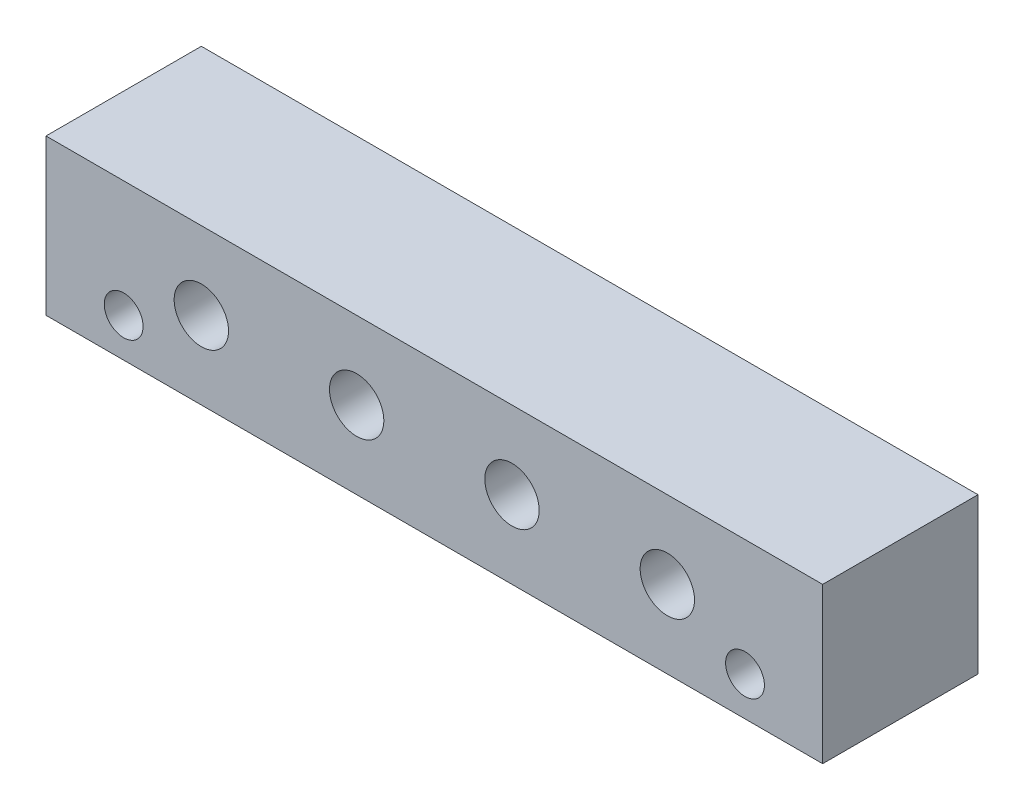
ISO-10303-21;
HEADER;
FILE_DESCRIPTION(('STEP AP214'),'2;1');
FILE_NAME('part.step','',(''),(''),'','','');
FILE_SCHEMA(('AUTOMOTIVE_DESIGN { 1 0 10303 214 1 1 1 1 }'));
ENDSEC;
DATA;
#1=APPLICATION_CONTEXT('core data for automotive mechanical design processes');
#2=APPLICATION_PROTOCOL_DEFINITION('international standard','automotive_design',2000,#1);
#3=PRODUCT_CONTEXT('',#1,'mechanical');
#4=PRODUCT('Part','Part','',(#3));
#5=PRODUCT_RELATED_PRODUCT_CATEGORY('part','',(#4));
#6=PRODUCT_DEFINITION_FORMATION('','',#4);
#7=PRODUCT_DEFINITION_CONTEXT('part definition',#1,'design');
#8=PRODUCT_DEFINITION('design','',#6,#7);
#9=PRODUCT_DEFINITION_SHAPE('','',#8);
#10=(LENGTH_UNIT() NAMED_UNIT(*) SI_UNIT(.MILLI.,.METRE.));
#11=(NAMED_UNIT(*) PLANE_ANGLE_UNIT() SI_UNIT($,.RADIAN.));
#12=(NAMED_UNIT(*) SI_UNIT($,.STERADIAN.) SOLID_ANGLE_UNIT());
#13=UNCERTAINTY_MEASURE_WITH_UNIT(LENGTH_MEASURE(1.E-05),#10,'distance_accuracy_value','');
#14=(GEOMETRIC_REPRESENTATION_CONTEXT(3) GLOBAL_UNCERTAINTY_ASSIGNED_CONTEXT((#13)) GLOBAL_UNIT_ASSIGNED_CONTEXT((#10,
#11,#12)) REPRESENTATION_CONTEXT('',''));
#15=CARTESIAN_POINT('',(0.,0.,0.));
#16=DIRECTION('',(0.,0.,1.));
#17=DIRECTION('',(1.,0.,0.));
#18=AXIS2_PLACEMENT_3D('',#15,#16,#17);
#19=CARTESIAN_POINT('',(0.,0.,10.));
#20=DIRECTION('',(0.,0.,-1.));
#21=DIRECTION('',(-1.,0.,0.));
#22=AXIS2_PLACEMENT_3D('',#19,#20,#21);
#23=PLANE('',#22);
#24=DIRECTION('',(0.,-1.,0.));
#25=VECTOR('',#24,1.);
#26=CARTESIAN_POINT('',(0.,0.,10.));
#27=LINE('',#26,#25);
#28=CARTESIAN_POINT('',(0.,10.,10.));
#29=VERTEX_POINT('',#28);
#30=CARTESIAN_POINT('',(0.,0.,10.));
#31=VERTEX_POINT('',#30);
#32=EDGE_CURVE('E85',#29,#31,#27,.T.);
#33=ORIENTED_EDGE('',*,*,#32,.T.);
#34=DIRECTION('',(1.,0.,0.));
#35=VECTOR('',#34,1.);
#36=CARTESIAN_POINT('',(0.,0.,10.));
#37=LINE('',#36,#35);
#38=CARTESIAN_POINT('',(50.,0.,10.));
#39=VERTEX_POINT('',#38);
#40=EDGE_CURVE('E80',#31,#39,#37,.T.);
#41=ORIENTED_EDGE('',*,*,#40,.T.);
#42=DIRECTION('',(0.,1.,0.));
#43=VECTOR('',#42,1.);
#44=CARTESIAN_POINT('',(50.,0.,10.));
#45=LINE('',#44,#43);
#46=CARTESIAN_POINT('',(50.,10.,10.));
#47=VERTEX_POINT('',#46);
#48=EDGE_CURVE('E83',#39,#47,#45,.T.);
#49=ORIENTED_EDGE('',*,*,#48,.T.);
#50=DIRECTION('',(-1.,0.,0.));
#51=VECTOR('',#50,1.);
#52=CARTESIAN_POINT('',(0.,10.,10.));
#53=LINE('',#52,#51);
#54=EDGE_CURVE('E50',#47,#29,#53,.T.);
#55=ORIENTED_EDGE('',*,*,#54,.T.);
#56=EDGE_LOOP('',(#33,#41,#49,#55));
#57=FACE_BOUND('',#56,.T.);
#58=CARTESIAN_POINT('',(5.,2.5,10.));
#59=DIRECTION('',(0.,0.,1.));
#60=DIRECTION('',(1.,0.,0.));
#61=AXIS2_PLACEMENT_3D('',#58,#59,#60);
#62=CIRCLE('',#61,1.25);
#63=CARTESIAN_POINT('',(6.25,2.5,10.));
#64=VERTEX_POINT('',#63);
#65=EDGE_CURVE('E100',#64,#64,#62,.T.);
#66=ORIENTED_EDGE('',*,*,#65,.F.);
#67=EDGE_LOOP('',(#66));
#68=FACE_BOUND('',#67,.T.);
#69=CARTESIAN_POINT('',(45.,2.5,10.));
#70=DIRECTION('',(0.,0.,1.));
#71=DIRECTION('',(1.,0.,0.));
#72=AXIS2_PLACEMENT_3D('',#69,#70,#71);
#73=CIRCLE('',#72,1.25);
#74=CARTESIAN_POINT('',(46.25,2.5,10.));
#75=VERTEX_POINT('',#74);
#76=EDGE_CURVE('E115',#75,#75,#73,.T.);
#77=ORIENTED_EDGE('',*,*,#76,.F.);
#78=EDGE_LOOP('',(#77));
#79=FACE_BOUND('',#78,.T.);
#80=CARTESIAN_POINT('',(40.,5.,10.));
#81=DIRECTION('',(0.,0.,1.));
#82=DIRECTION('',(1.,0.,0.));
#83=AXIS2_PLACEMENT_3D('',#80,#81,#82);
#84=CIRCLE('',#83,1.75);
#85=CARTESIAN_POINT('',(41.75,5.,10.));
#86=VERTEX_POINT('',#85);
#87=EDGE_CURVE('E121',#86,#86,#84,.T.);
#88=ORIENTED_EDGE('',*,*,#87,.F.);
#89=EDGE_LOOP('',(#88));
#90=FACE_BOUND('',#89,.T.);
#91=CARTESIAN_POINT('',(30.,4.99999999999993,10.));
#92=DIRECTION('',(0.,0.,1.));
#93=DIRECTION('',(1.,0.,0.));
#94=AXIS2_PLACEMENT_3D('',#91,#92,#93);
#95=CIRCLE('',#94,1.75);
#96=CARTESIAN_POINT('',(31.75,4.99999999999993,10.));
#97=VERTEX_POINT('',#96);
#98=EDGE_CURVE('E127',#97,#97,#95,.T.);
#99=ORIENTED_EDGE('',*,*,#98,.F.);
#100=EDGE_LOOP('',(#99));
#101=FACE_BOUND('',#100,.T.);
#102=CARTESIAN_POINT('',(20.,4.99999999999986,10.));
#103=DIRECTION('',(0.,0.,1.));
#104=DIRECTION('',(1.,0.,0.));
#105=AXIS2_PLACEMENT_3D('',#102,#103,#104);
#106=CIRCLE('',#105,1.75);
#107=CARTESIAN_POINT('',(21.75,4.99999999999986,10.));
#108=VERTEX_POINT('',#107);
#109=EDGE_CURVE('E133',#108,#108,#106,.T.);
#110=ORIENTED_EDGE('',*,*,#109,.F.);
#111=EDGE_LOOP('',(#110));
#112=FACE_BOUND('',#111,.T.);
#113=CARTESIAN_POINT('',(10.,4.99999999999979,10.));
#114=DIRECTION('',(0.,0.,1.));
#115=DIRECTION('',(1.,0.,0.));
#116=AXIS2_PLACEMENT_3D('',#113,#114,#115);
#117=CIRCLE('',#116,1.75);
#118=CARTESIAN_POINT('',(11.75,4.99999999999979,10.));
#119=VERTEX_POINT('',#118);
#120=EDGE_CURVE('E139',#119,#119,#117,.T.);
#121=ORIENTED_EDGE('',*,*,#120,.F.);
#122=EDGE_LOOP('',(#121));
#123=FACE_BOUND('',#122,.T.);
#124=ADVANCED_FACE('F33',(#57,#68,#79,#90,#101,#112,#123),#23,.F.);
#125=CARTESIAN_POINT('',(0.,0.,0.));
#126=DIRECTION('',(0.,0.,-1.));
#127=DIRECTION('',(-1.,0.,0.));
#128=AXIS2_PLACEMENT_3D('',#125,#126,#127);
#129=PLANE('',#128);
#130=CARTESIAN_POINT('',(20.,4.99999999999986,0.));
#131=DIRECTION('',(0.,0.,1.));
#132=DIRECTION('',(1.,0.,0.));
#133=AXIS2_PLACEMENT_3D('',#130,#131,#132);
#134=CIRCLE('',#133,1.75);
#135=CARTESIAN_POINT('',(21.75,4.99999999999986,0.));
#136=VERTEX_POINT('',#135);
#137=EDGE_CURVE('E136',#136,#136,#134,.T.);
#138=ORIENTED_EDGE('',*,*,#137,.T.);
#139=EDGE_LOOP('',(#138));
#140=FACE_BOUND('',#139,.T.);
#141=CARTESIAN_POINT('',(40.,5.,0.));
#142=DIRECTION('',(0.,0.,1.));
#143=DIRECTION('',(1.,0.,0.));
#144=AXIS2_PLACEMENT_3D('',#141,#142,#143);
#145=CIRCLE('',#144,1.75);
#146=CARTESIAN_POINT('',(41.75,5.,0.));
#147=VERTEX_POINT('',#146);
#148=EDGE_CURVE('E124',#147,#147,#145,.T.);
#149=ORIENTED_EDGE('',*,*,#148,.T.);
#150=EDGE_LOOP('',(#149));
#151=FACE_BOUND('',#150,.T.);
#152=CARTESIAN_POINT('',(5.,2.5,0.));
#153=DIRECTION('',(0.,0.,1.));
#154=DIRECTION('',(1.,0.,0.));
#155=AXIS2_PLACEMENT_3D('',#152,#153,#154);
#156=CIRCLE('',#155,1.25);
#157=CARTESIAN_POINT('',(6.25,2.5,0.));
#158=VERTEX_POINT('',#157);
#159=EDGE_CURVE('E112',#158,#158,#156,.T.);
#160=ORIENTED_EDGE('',*,*,#159,.T.);
#161=EDGE_LOOP('',(#160));
#162=FACE_BOUND('',#161,.T.);
#163=DIRECTION('',(0.,-1.,0.));
#164=VECTOR('',#163,1.);
#165=CARTESIAN_POINT('',(0.,0.,0.));
#166=LINE('',#165,#164);
#167=CARTESIAN_POINT('',(0.,10.,0.));
#168=VERTEX_POINT('',#167);
#169=CARTESIAN_POINT('',(0.,0.,0.));
#170=VERTEX_POINT('',#169);
#171=EDGE_CURVE('E97',#168,#170,#166,.T.);
#172=ORIENTED_EDGE('',*,*,#171,.F.);
#173=DIRECTION('',(-1.,0.,0.));
#174=VECTOR('',#173,1.);
#175=CARTESIAN_POINT('',(0.,10.,0.));
#176=LINE('',#175,#174);
#177=CARTESIAN_POINT('',(50.,10.,0.));
#178=VERTEX_POINT('',#177);
#179=EDGE_CURVE('E73',#178,#168,#176,.T.);
#180=ORIENTED_EDGE('',*,*,#179,.F.);
#181=DIRECTION('',(0.,1.,0.));
#182=VECTOR('',#181,1.);
#183=CARTESIAN_POINT('',(50.,0.,0.));
#184=LINE('',#183,#182);
#185=CARTESIAN_POINT('',(50.,0.,0.));
#186=VERTEX_POINT('',#185);
#187=EDGE_CURVE('E67',#186,#178,#184,.T.);
#188=ORIENTED_EDGE('',*,*,#187,.F.);
#189=DIRECTION('',(1.,0.,0.));
#190=VECTOR('',#189,1.);
#191=CARTESIAN_POINT('',(0.,0.,0.));
#192=LINE('',#191,#190);
#193=EDGE_CURVE('E89',#170,#186,#192,.T.);
#194=ORIENTED_EDGE('',*,*,#193,.F.);
#195=EDGE_LOOP('',(#172,#180,#188,#194));
#196=FACE_BOUND('',#195,.T.);
#197=CARTESIAN_POINT('',(45.,2.5,0.));
#198=DIRECTION('',(0.,0.,1.));
#199=DIRECTION('',(1.,0.,0.));
#200=AXIS2_PLACEMENT_3D('',#197,#198,#199);
#201=CIRCLE('',#200,1.25);
#202=CARTESIAN_POINT('',(46.25,2.5,0.));
#203=VERTEX_POINT('',#202);
#204=EDGE_CURVE('E118',#203,#203,#201,.T.);
#205=ORIENTED_EDGE('',*,*,#204,.T.);
#206=EDGE_LOOP('',(#205));
#207=FACE_BOUND('',#206,.T.);
#208=CARTESIAN_POINT('',(30.,4.99999999999993,0.));
#209=DIRECTION('',(0.,0.,1.));
#210=DIRECTION('',(1.,0.,0.));
#211=AXIS2_PLACEMENT_3D('',#208,#209,#210);
#212=CIRCLE('',#211,1.75);
#213=CARTESIAN_POINT('',(31.75,4.99999999999993,0.));
#214=VERTEX_POINT('',#213);
#215=EDGE_CURVE('E130',#214,#214,#212,.T.);
#216=ORIENTED_EDGE('',*,*,#215,.T.);
#217=EDGE_LOOP('',(#216));
#218=FACE_BOUND('',#217,.T.);
#219=CARTESIAN_POINT('',(10.,4.99999999999979,0.));
#220=DIRECTION('',(0.,0.,1.));
#221=DIRECTION('',(1.,0.,0.));
#222=AXIS2_PLACEMENT_3D('',#219,#220,#221);
#223=CIRCLE('',#222,1.75);
#224=CARTESIAN_POINT('',(11.75,4.99999999999979,0.));
#225=VERTEX_POINT('',#224);
#226=EDGE_CURVE('E142',#225,#225,#223,.T.);
#227=ORIENTED_EDGE('',*,*,#226,.T.);
#228=EDGE_LOOP('',(#227));
#229=FACE_BOUND('',#228,.T.);
#230=ADVANCED_FACE('F108',(#140,#151,#162,#196,#207,#218,#229),#129,.T.);
#231=CARTESIAN_POINT('',(0.,0.,10.));
#232=DIRECTION('',(1.,0.,0.));
#233=DIRECTION('',(0.,0.,-1.));
#234=AXIS2_PLACEMENT_3D('',#231,#232,#233);
#235=PLANE('',#234);
#236=ORIENTED_EDGE('',*,*,#171,.T.);
#237=DIRECTION('',(0.,0.,-1.));
#238=VECTOR('',#237,1.);
#239=CARTESIAN_POINT('',(0.,0.,10.));
#240=LINE('',#239,#238);
#241=EDGE_CURVE('E11',#31,#170,#240,.T.);
#242=ORIENTED_EDGE('',*,*,#241,.F.);
#243=ORIENTED_EDGE('',*,*,#32,.F.);
#244=DIRECTION('',(0.,0.,-1.));
#245=VECTOR('',#244,1.);
#246=CARTESIAN_POINT('',(0.,10.,10.));
#247=LINE('',#246,#245);
#248=EDGE_CURVE('E93',#29,#168,#247,.T.);
#249=ORIENTED_EDGE('',*,*,#248,.T.);
#250=EDGE_LOOP('',(#236,#242,#243,#249));
#251=FACE_BOUND('',#250,.T.);
#252=ADVANCED_FACE('F35',(#251),#235,.F.);
#253=CARTESIAN_POINT('',(0.,0.,10.));
#254=DIRECTION('',(0.,1.,0.));
#255=DIRECTION('',(0.,0.,1.));
#256=AXIS2_PLACEMENT_3D('',#253,#254,#255);
#257=PLANE('',#256);
#258=ORIENTED_EDGE('',*,*,#193,.T.);
#259=DIRECTION('',(0.,0.,-1.));
#260=VECTOR('',#259,1.);
#261=CARTESIAN_POINT('',(50.,0.,10.));
#262=LINE('',#261,#260);
#263=EDGE_CURVE('E42',#39,#186,#262,.T.);
#264=ORIENTED_EDGE('',*,*,#263,.F.);
#265=ORIENTED_EDGE('',*,*,#40,.F.);
#266=ORIENTED_EDGE('',*,*,#241,.T.);
#267=EDGE_LOOP('',(#258,#264,#265,#266));
#268=FACE_BOUND('',#267,.T.);
#269=ADVANCED_FACE('F88',(#268),#257,.F.);
#270=CARTESIAN_POINT('',(50.,0.,10.));
#271=DIRECTION('',(-1.,0.,0.));
#272=DIRECTION('',(0.,0.,1.));
#273=AXIS2_PLACEMENT_3D('',#270,#271,#272);
#274=PLANE('',#273);
#275=ORIENTED_EDGE('',*,*,#187,.T.);
#276=DIRECTION('',(0.,0.,-1.));
#277=VECTOR('',#276,1.);
#278=CARTESIAN_POINT('',(50.,10.,10.));
#279=LINE('',#278,#277);
#280=EDGE_CURVE('E90',#47,#178,#279,.T.);
#281=ORIENTED_EDGE('',*,*,#280,.F.);
#282=ORIENTED_EDGE('',*,*,#48,.F.);
#283=ORIENTED_EDGE('',*,*,#263,.T.);
#284=EDGE_LOOP('',(#275,#281,#282,#283));
#285=FACE_BOUND('',#284,.T.);
#286=ADVANCED_FACE('F91',(#285),#274,.F.);
#287=CARTESIAN_POINT('',(0.,10.,10.));
#288=DIRECTION('',(0.,-1.,0.));
#289=DIRECTION('',(0.,0.,-1.));
#290=AXIS2_PLACEMENT_3D('',#287,#288,#289);
#291=PLANE('',#290);
#292=ORIENTED_EDGE('',*,*,#179,.T.);
#293=ORIENTED_EDGE('',*,*,#248,.F.);
#294=ORIENTED_EDGE('',*,*,#54,.F.);
#295=ORIENTED_EDGE('',*,*,#280,.T.);
#296=EDGE_LOOP('',(#292,#293,#294,#295));
#297=FACE_BOUND('',#296,.T.);
#298=ADVANCED_FACE('F105',(#297),#291,.F.);
#299=CARTESIAN_POINT('',(5.,2.5,10.));
#300=DIRECTION('',(0.,0.,-1.));
#301=DIRECTION('',(-1.,0.,0.));
#302=AXIS2_PLACEMENT_3D('',#299,#300,#301);
#303=CYLINDRICAL_SURFACE('',#302,1.25);
#304=ORIENTED_EDGE('',*,*,#65,.T.);
#305=EDGE_LOOP('',(#304));
#306=FACE_BOUND('',#305,.T.);
#307=ORIENTED_EDGE('',*,*,#159,.F.);
#308=EDGE_LOOP('',(#307));
#309=FACE_BOUND('',#308,.T.);
#310=ADVANCED_FACE('F159',(#306,#309),#303,.F.);
#311=CARTESIAN_POINT('',(45.,2.5,10.));
#312=DIRECTION('',(0.,0.,-1.));
#313=DIRECTION('',(-1.,0.,0.));
#314=AXIS2_PLACEMENT_3D('',#311,#312,#313);
#315=CYLINDRICAL_SURFACE('',#314,1.25);
#316=ORIENTED_EDGE('',*,*,#76,.T.);
#317=EDGE_LOOP('',(#316));
#318=FACE_BOUND('',#317,.T.);
#319=ORIENTED_EDGE('',*,*,#204,.F.);
#320=EDGE_LOOP('',(#319));
#321=FACE_BOUND('',#320,.T.);
#322=ADVANCED_FACE('F205',(#318,#321),#315,.F.);
#323=CARTESIAN_POINT('',(40.,5.,10.));
#324=DIRECTION('',(0.,0.,-1.));
#325=DIRECTION('',(-1.,0.,0.));
#326=AXIS2_PLACEMENT_3D('',#323,#324,#325);
#327=CYLINDRICAL_SURFACE('',#326,1.75);
#328=ORIENTED_EDGE('',*,*,#87,.T.);
#329=EDGE_LOOP('',(#328));
#330=FACE_BOUND('',#329,.T.);
#331=ORIENTED_EDGE('',*,*,#148,.F.);
#332=EDGE_LOOP('',(#331));
#333=FACE_BOUND('',#332,.T.);
#334=ADVANCED_FACE('F213',(#330,#333),#327,.F.);
#335=CARTESIAN_POINT('',(30.,4.99999999999993,10.));
#336=DIRECTION('',(0.,0.,-1.));
#337=DIRECTION('',(-1.,0.,0.));
#338=AXIS2_PLACEMENT_3D('',#335,#336,#337);
#339=CYLINDRICAL_SURFACE('',#338,1.75);
#340=ORIENTED_EDGE('',*,*,#98,.T.);
#341=EDGE_LOOP('',(#340));
#342=FACE_BOUND('',#341,.T.);
#343=ORIENTED_EDGE('',*,*,#215,.F.);
#344=EDGE_LOOP('',(#343));
#345=FACE_BOUND('',#344,.T.);
#346=ADVANCED_FACE('F221',(#342,#345),#339,.F.);
#347=CARTESIAN_POINT('',(20.,4.99999999999986,10.));
#348=DIRECTION('',(0.,0.,-1.));
#349=DIRECTION('',(-1.,0.,0.));
#350=AXIS2_PLACEMENT_3D('',#347,#348,#349);
#351=CYLINDRICAL_SURFACE('',#350,1.75);
#352=ORIENTED_EDGE('',*,*,#109,.T.);
#353=EDGE_LOOP('',(#352));
#354=FACE_BOUND('',#353,.T.);
#355=ORIENTED_EDGE('',*,*,#137,.F.);
#356=EDGE_LOOP('',(#355));
#357=FACE_BOUND('',#356,.T.);
#358=ADVANCED_FACE('F230',(#354,#357),#351,.F.);
#359=CARTESIAN_POINT('',(10.,4.99999999999979,10.));
#360=DIRECTION('',(0.,0.,-1.));
#361=DIRECTION('',(-1.,0.,0.));
#362=AXIS2_PLACEMENT_3D('',#359,#360,#361);
#363=CYLINDRICAL_SURFACE('',#362,1.75);
#364=ORIENTED_EDGE('',*,*,#120,.T.);
#365=EDGE_LOOP('',(#364));
#366=FACE_BOUND('',#365,.T.);
#367=ORIENTED_EDGE('',*,*,#226,.F.);
#368=EDGE_LOOP('',(#367));
#369=FACE_BOUND('',#368,.T.);
#370=ADVANCED_FACE('F148',(#366,#369),#363,.F.);
#371=CLOSED_SHELL('',(#124,#230,#252,#269,#286,#298,#310,#322,#334,#346,#358,#370));
#372=MANIFOLD_SOLID_BREP('B2',#371);
#373=ADVANCED_BREP_SHAPE_REPRESENTATION('',(#18,#372),#14);
#374=SHAPE_DEFINITION_REPRESENTATION(#9,#373);
ENDSEC;
END-ISO-10303-21;
